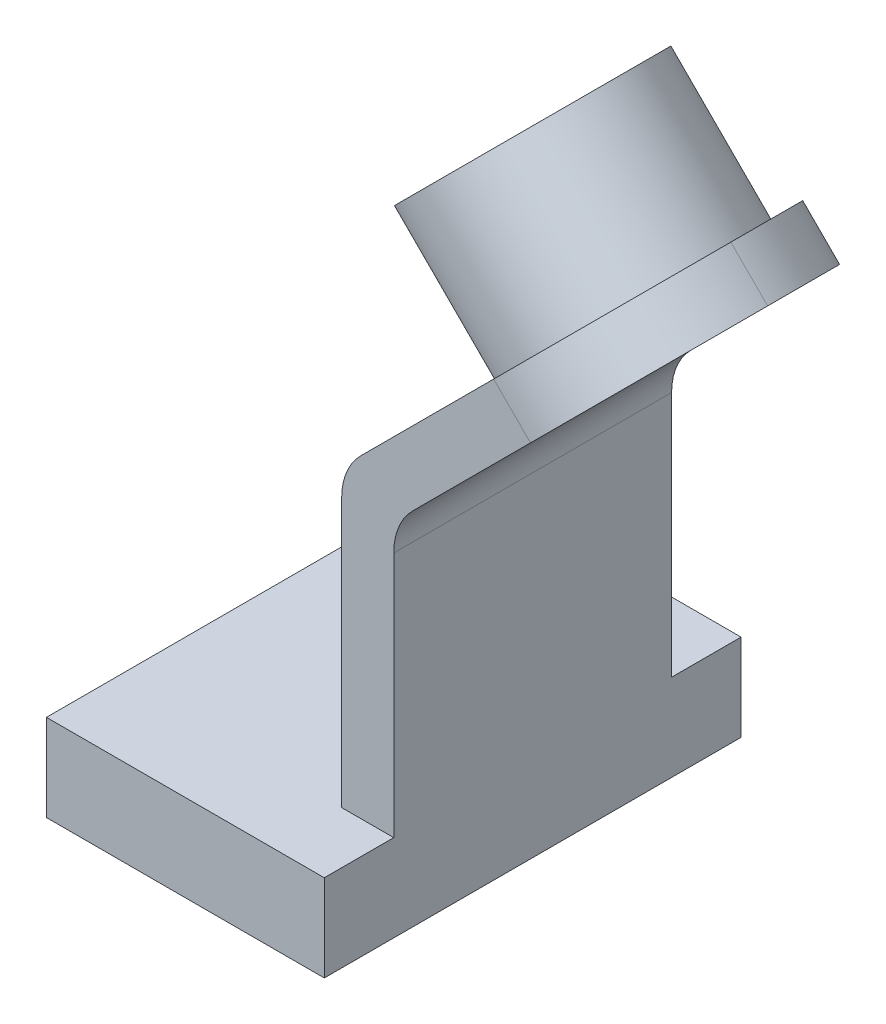
ISO-10303-21;
HEADER;
FILE_DESCRIPTION(('STEP AP214'),'2;1');
FILE_NAME('part.step','',(''),(''),'','','');
FILE_SCHEMA(('AUTOMOTIVE_DESIGN { 1 0 10303 214 1 1 1 1 }'));
ENDSEC;
DATA;
#1=APPLICATION_CONTEXT('core data for automotive mechanical design processes');
#2=APPLICATION_PROTOCOL_DEFINITION('international standard','automotive_design',2000,#1);
#3=PRODUCT_CONTEXT('',#1,'mechanical');
#4=PRODUCT('Part','Part','',(#3));
#5=PRODUCT_RELATED_PRODUCT_CATEGORY('part','',(#4));
#6=PRODUCT_DEFINITION_FORMATION('','',#4);
#7=PRODUCT_DEFINITION_CONTEXT('part definition',#1,'design');
#8=PRODUCT_DEFINITION('design','',#6,#7);
#9=PRODUCT_DEFINITION_SHAPE('','',#8);
#10=(LENGTH_UNIT() NAMED_UNIT(*) SI_UNIT(.MILLI.,.METRE.));
#11=(NAMED_UNIT(*) PLANE_ANGLE_UNIT() SI_UNIT($,.RADIAN.));
#12=(NAMED_UNIT(*) SI_UNIT($,.STERADIAN.) SOLID_ANGLE_UNIT());
#13=UNCERTAINTY_MEASURE_WITH_UNIT(LENGTH_MEASURE(1.E-05),#10,'distance_accuracy_value','');
#14=(GEOMETRIC_REPRESENTATION_CONTEXT(3) GLOBAL_UNCERTAINTY_ASSIGNED_CONTEXT((#13)) GLOBAL_UNIT_ASSIGNED_CONTEXT((#10,
#11,#12)) REPRESENTATION_CONTEXT('',''));
#15=CARTESIAN_POINT('',(0.,0.,0.));
#16=DIRECTION('',(0.,0.,1.));
#17=DIRECTION('',(1.,0.,0.));
#18=AXIS2_PLACEMENT_3D('',#15,#16,#17);
#19=CARTESIAN_POINT('',(0.,10.,48.));
#20=DIRECTION('',(0.,1.,0.));
#21=DIRECTION('',(0.,0.,1.));
#22=AXIS2_PLACEMENT_3D('',#19,#20,#21);
#23=PLANE('',#22);
#24=DIRECTION('',(0.,0.,-1.));
#25=VECTOR('',#24,1.);
#26=CARTESIAN_POINT('',(20.,10.,32.));
#27=LINE('',#26,#25);
#28=CARTESIAN_POINT('',(20.,10.,32.));
#29=VERTEX_POINT('',#28);
#30=CARTESIAN_POINT('',(20.,10.,-32.));
#31=VERTEX_POINT('',#30);
#32=EDGE_CURVE('E130',#29,#31,#27,.T.);
#33=ORIENTED_EDGE('',*,*,#32,.T.);
#34=DIRECTION('',(1.,0.,0.));
#35=VECTOR('',#34,1.);
#36=CARTESIAN_POINT('',(0.,10.,-32.));
#37=LINE('',#36,#35);
#38=CARTESIAN_POINT('',(32.,10.,-32.));
#39=VERTEX_POINT('',#38);
#40=EDGE_CURVE('E166',#31,#39,#37,.T.);
#41=ORIENTED_EDGE('',*,*,#40,.T.);
#42=DIRECTION('',(0.,0.,-1.));
#43=VECTOR('',#42,1.);
#44=CARTESIAN_POINT('',(32.,10.,48.));
#45=LINE('',#44,#43);
#46=CARTESIAN_POINT('',(32.,10.,-48.));
#47=VERTEX_POINT('',#46);
#48=EDGE_CURVE('E196',#39,#47,#45,.T.);
#49=ORIENTED_EDGE('',*,*,#48,.T.);
#50=DIRECTION('',(1.,0.,0.));
#51=VECTOR('',#50,1.);
#52=CARTESIAN_POINT('',(0.,10.,-48.));
#53=LINE('',#52,#51);
#54=CARTESIAN_POINT('',(-32.,10.,-48.));
#55=VERTEX_POINT('',#54);
#56=EDGE_CURVE('E188',#55,#47,#53,.T.);
#57=ORIENTED_EDGE('',*,*,#56,.F.);
#58=DIRECTION('',(0.,0.,-1.));
#59=VECTOR('',#58,1.);
#60=CARTESIAN_POINT('',(-32.,10.,48.));
#61=LINE('',#60,#59);
#62=CARTESIAN_POINT('',(-32.,10.,48.));
#63=VERTEX_POINT('',#62);
#64=EDGE_CURVE('E194',#63,#55,#61,.T.);
#65=ORIENTED_EDGE('',*,*,#64,.F.);
#66=DIRECTION('',(1.,0.,0.));
#67=VECTOR('',#66,1.);
#68=CARTESIAN_POINT('',(0.,10.,48.));
#69=LINE('',#68,#67);
#70=CARTESIAN_POINT('',(32.,10.,48.));
#71=VERTEX_POINT('',#70);
#72=EDGE_CURVE('E177',#63,#71,#69,.T.);
#73=ORIENTED_EDGE('',*,*,#72,.T.);
#74=CARTESIAN_POINT('',(32.,10.,32.));
#75=VERTEX_POINT('',#74);
#76=EDGE_CURVE('E155',#71,#75,#45,.T.);
#77=ORIENTED_EDGE('',*,*,#76,.T.);
#78=DIRECTION('',(1.,0.,0.));
#79=VECTOR('',#78,1.);
#80=CARTESIAN_POINT('',(0.,10.,32.));
#81=LINE('',#80,#79);
#82=EDGE_CURVE('E147',#29,#75,#81,.T.);
#83=ORIENTED_EDGE('',*,*,#82,.F.);
#84=EDGE_LOOP('',(#33,#41,#49,#57,#65,#73,#77,#83));
#85=FACE_BOUND('',#84,.T.);
#86=ADVANCED_FACE('F35',(#85),#23,.T.);
#87=CARTESIAN_POINT('',(0.,-10.,48.));
#88=DIRECTION('',(0.,1.,0.));
#89=DIRECTION('',(0.,0.,1.));
#90=AXIS2_PLACEMENT_3D('',#87,#88,#89);
#91=PLANE('',#90);
#92=DIRECTION('',(1.,0.,0.));
#93=VECTOR('',#92,1.);
#94=CARTESIAN_POINT('',(0.,-10.,-48.));
#95=LINE('',#94,#93);
#96=CARTESIAN_POINT('',(-32.,-10.,-48.));
#97=VERTEX_POINT('',#96);
#98=CARTESIAN_POINT('',(32.,-10.,-48.));
#99=VERTEX_POINT('',#98);
#100=EDGE_CURVE('E142',#97,#99,#95,.T.);
#101=ORIENTED_EDGE('',*,*,#100,.T.);
#102=DIRECTION('',(0.,0.,-1.));
#103=VECTOR('',#102,1.);
#104=CARTESIAN_POINT('',(32.,-10.,48.));
#105=LINE('',#104,#103);
#106=CARTESIAN_POINT('',(32.,-10.,48.));
#107=VERTEX_POINT('',#106);
#108=EDGE_CURVE('E198',#107,#99,#105,.T.);
#109=ORIENTED_EDGE('',*,*,#108,.F.);
#110=DIRECTION('',(1.,0.,0.));
#111=VECTOR('',#110,1.);
#112=CARTESIAN_POINT('',(0.,-10.,48.));
#113=LINE('',#112,#111);
#114=CARTESIAN_POINT('',(-32.,-10.,48.));
#115=VERTEX_POINT('',#114);
#116=EDGE_CURVE('E171',#115,#107,#113,.T.);
#117=ORIENTED_EDGE('',*,*,#116,.F.);
#118=DIRECTION('',(0.,0.,-1.));
#119=VECTOR('',#118,1.);
#120=CARTESIAN_POINT('',(-32.,-10.,48.));
#121=LINE('',#120,#119);
#122=EDGE_CURVE('E182',#115,#97,#121,.T.);
#123=ORIENTED_EDGE('',*,*,#122,.T.);
#124=EDGE_LOOP('',(#101,#109,#117,#123));
#125=FACE_BOUND('',#124,.T.);
#126=ADVANCED_FACE('F290',(#125),#91,.F.);
#127=CARTESIAN_POINT('',(32.,0.,48.));
#128=DIRECTION('',(-1.,0.,0.));
#129=DIRECTION('',(0.,0.,1.));
#130=AXIS2_PLACEMENT_3D('',#127,#128,#129);
#131=PLANE('',#130);
#132=DIRECTION('',(0.,1.,0.));
#133=VECTOR('',#132,1.);
#134=CARTESIAN_POINT('',(32.,0.,-32.));
#135=LINE('',#134,#133);
#136=CARTESIAN_POINT('',(32.,66.7867965644037,-32.));
#137=VERTEX_POINT('',#136);
#138=EDGE_CURVE('E168',#39,#137,#135,.T.);
#139=ORIENTED_EDGE('',*,*,#138,.T.);
#140=DIRECTION('',(0.,0.,-1.));
#141=VECTOR('',#140,1.);
#142=CARTESIAN_POINT('',(32.,66.7867965644037,32.));
#143=LINE('',#142,#141);
#144=CARTESIAN_POINT('',(32.,66.7867965644037,32.));
#145=VERTEX_POINT('',#144);
#146=EDGE_CURVE('E50',#137,#145,#143,.F.);
#147=ORIENTED_EDGE('',*,*,#146,.T.);
#148=DIRECTION('',(0.,1.,0.));
#149=VECTOR('',#148,1.);
#150=CARTESIAN_POINT('',(32.,0.,32.));
#151=LINE('',#150,#149);
#152=EDGE_CURVE('E143',#75,#145,#151,.T.);
#153=ORIENTED_EDGE('',*,*,#152,.F.);
#154=ORIENTED_EDGE('',*,*,#76,.F.);
#155=DIRECTION('',(0.,1.,0.));
#156=VECTOR('',#155,1.);
#157=CARTESIAN_POINT('',(32.,0.,48.));
#158=LINE('',#157,#156);
#159=EDGE_CURVE('E174',#107,#71,#158,.T.);
#160=ORIENTED_EDGE('',*,*,#159,.F.);
#161=ORIENTED_EDGE('',*,*,#108,.T.);
#162=DIRECTION('',(0.,1.,0.));
#163=VECTOR('',#162,1.);
#164=CARTESIAN_POINT('',(32.,0.,-48.));
#165=LINE('',#164,#163);
#166=EDGE_CURVE('E185',#99,#47,#165,.T.);
#167=ORIENTED_EDGE('',*,*,#166,.T.);
#168=ORIENTED_EDGE('',*,*,#48,.F.);
#169=EDGE_LOOP('',(#139,#147,#153,#154,#160,#161,#167,#168));
#170=FACE_BOUND('',#169,.T.);
#171=ADVANCED_FACE('F236',(#170),#131,.F.);
#172=CARTESIAN_POINT('',(-32.,0.,48.));
#173=DIRECTION('',(-1.,0.,0.));
#174=DIRECTION('',(0.,0.,1.));
#175=AXIS2_PLACEMENT_3D('',#172,#173,#174);
#176=PLANE('',#175);
#177=DIRECTION('',(0.,1.,0.));
#178=VECTOR('',#177,1.);
#179=CARTESIAN_POINT('',(-32.,0.,-48.));
#180=LINE('',#179,#178);
#181=EDGE_CURVE('E175',#97,#55,#180,.T.);
#182=ORIENTED_EDGE('',*,*,#181,.F.);
#183=ORIENTED_EDGE('',*,*,#122,.F.);
#184=DIRECTION('',(0.,1.,0.));
#185=VECTOR('',#184,1.);
#186=CARTESIAN_POINT('',(-32.,0.,48.));
#187=LINE('',#186,#185);
#188=EDGE_CURVE('E179',#115,#63,#187,.T.);
#189=ORIENTED_EDGE('',*,*,#188,.T.);
#190=ORIENTED_EDGE('',*,*,#64,.T.);
#191=EDGE_LOOP('',(#182,#183,#189,#190));
#192=FACE_BOUND('',#191,.T.);
#193=ADVANCED_FACE('F283',(#192),#176,.T.);
#194=CARTESIAN_POINT('',(0.,0.,48.));
#195=DIRECTION('',(0.,0.,1.));
#196=DIRECTION('',(1.,0.,0.));
#197=AXIS2_PLACEMENT_3D('',#194,#195,#196);
#198=PLANE('',#197);
#199=ORIENTED_EDGE('',*,*,#116,.T.);
#200=ORIENTED_EDGE('',*,*,#159,.T.);
#201=ORIENTED_EDGE('',*,*,#72,.F.);
#202=ORIENTED_EDGE('',*,*,#188,.F.);
#203=EDGE_LOOP('',(#199,#200,#201,#202));
#204=FACE_BOUND('',#203,.T.);
#205=ADVANCED_FACE('F288',(#204),#198,.T.);
#206=CARTESIAN_POINT('',(0.,0.,-48.));
#207=DIRECTION('',(0.,0.,1.));
#208=DIRECTION('',(1.,0.,0.));
#209=AXIS2_PLACEMENT_3D('',#206,#207,#208);
#210=PLANE('',#209);
#211=ORIENTED_EDGE('',*,*,#100,.F.);
#212=ORIENTED_EDGE('',*,*,#181,.T.);
#213=ORIENTED_EDGE('',*,*,#56,.T.);
#214=ORIENTED_EDGE('',*,*,#166,.F.);
#215=EDGE_LOOP('',(#211,#212,#213,#214));
#216=FACE_BOUND('',#215,.T.);
#217=ADVANCED_FACE('F280',(#216),#210,.F.);
#218=CARTESIAN_POINT('',(-20.4999999999996,20.499999999999,32.));
#219=DIRECTION('',(-0.707106781186557,0.707106781186538,0.));
#220=DIRECTION('',(-0.707106781186538,-0.707106781186557,0.));
#221=AXIS2_PLACEMENT_3D('',#218,#219,#220);
#222=PLANE('',#221);
#223=DIRECTION('',(0.707106781186538,0.707106781186557,0.));
#224=VECTOR('',#223,1.);
#225=CARTESIAN_POINT('',(-20.4999999999996,20.499999999999,32.));
#226=LINE('',#225,#224);
#227=CARTESIAN_POINT('',(36.3933982822017,77.3933982822017,32.));
#228=VERTEX_POINT('',#227);
#229=CARTESIAN_POINT('',(63.5,104.500000000001,32.));
#230=VERTEX_POINT('',#229);
#231=EDGE_CURVE('E169',#228,#230,#226,.T.);
#232=ORIENTED_EDGE('',*,*,#231,.F.);
#233=DIRECTION('',(0.,0.,-1.));
#234=VECTOR('',#233,1.);
#235=CARTESIAN_POINT('',(36.3933982822016,77.3933982822017,-32.));
#236=LINE('',#235,#234);
#237=CARTESIAN_POINT('',(36.3933982822017,77.3933982822017,-32.));
#238=VERTEX_POINT('',#237);
#239=EDGE_CURVE('E227',#228,#238,#236,.T.);
#240=ORIENTED_EDGE('',*,*,#239,.T.);
#241=DIRECTION('',(0.707106781186538,0.707106781186557,0.));
#242=VECTOR('',#241,1.);
#243=CARTESIAN_POINT('',(-20.4999999999996,20.499999999999,-32.));
#244=LINE('',#243,#242);
#245=CARTESIAN_POINT('',(63.5,104.500000000001,-32.));
#246=VERTEX_POINT('',#245);
#247=EDGE_CURVE('E160',#238,#246,#244,.T.);
#248=ORIENTED_EDGE('',*,*,#247,.T.);
#249=CARTESIAN_POINT('',(63.5,104.500000000001,0.));
#250=DIRECTION('',(-0.707106781186557,0.707106781186538,0.));
#251=DIRECTION('',(-0.707106781186538,-0.707106781186557,0.));
#252=AXIS2_PLACEMENT_3D('',#249,#250,#251);
#253=CIRCLE('',#252,32.);
#254=CARTESIAN_POINT('',(86.1274169979692,127.127416997971,0.));
#255=VERTEX_POINT('',#254);
#256=EDGE_CURVE('E212',#246,#255,#253,.F.);
#257=ORIENTED_EDGE('',*,*,#256,.T.);
#258=CARTESIAN_POINT('',(63.5,104.500000000001,0.));
#259=DIRECTION('',(-0.707106781186557,0.707106781186538,0.));
#260=DIRECTION('',(-0.707106781186538,-0.707106781186557,0.));
#261=AXIS2_PLACEMENT_3D('',#258,#259,#260);
#262=CIRCLE('',#261,32.);
#263=EDGE_CURVE('E209',#255,#230,#262,.F.);
#264=ORIENTED_EDGE('',*,*,#263,.T.);
#265=EDGE_LOOP('',(#232,#240,#248,#257,#264));
#266=FACE_BOUND('',#265,.T.);
#267=ADVANCED_FACE('F238',(#266),#222,.F.);
#268=CARTESIAN_POINT('',(-28.9852813742383,28.9852813742375,32.));
#269=DIRECTION('',(-0.707106781186557,0.707106781186538,0.));
#270=DIRECTION('',(-0.707106781186538,-0.707106781186557,0.));
#271=AXIS2_PLACEMENT_3D('',#268,#269,#270);
#272=PLANE('',#271);
#273=CARTESIAN_POINT('',(55.0147186257608,112.985281374239,0.));
#274=DIRECTION('',(-0.707106781186548,0.707106781186547,0.));
#275=DIRECTION('',(-0.707106781186547,-0.707106781186548,0.));
#276=AXIS2_PLACEMENT_3D('',#273,#274,#275);
#277=CIRCLE('',#276,26.0000000000004);
#278=CARTESIAN_POINT('',(36.6299423149103,94.6005050633887,0.));
#279=VERTEX_POINT('',#278);
#280=EDGE_CURVE('E249',#279,#279,#277,.T.);
#281=ORIENTED_EDGE('',*,*,#280,.F.);
#282=EDGE_LOOP('',(#281));
#283=FACE_BOUND('',#282,.T.);
#284=DIRECTION('',(0.707106781186538,0.707106781186557,0.));
#285=VECTOR('',#284,1.);
#286=CARTESIAN_POINT('',(-28.9852813742383,28.9852813742375,-32.));
#287=LINE('',#286,#285);
#288=CARTESIAN_POINT('',(24.3933982822017,82.3639610306788,-32.));
#289=VERTEX_POINT('',#288);
#290=CARTESIAN_POINT('',(55.0147186257613,112.985281374239,-32.));
#291=VERTEX_POINT('',#290);
#292=EDGE_CURVE('E162',#289,#291,#287,.T.);
#293=ORIENTED_EDGE('',*,*,#292,.F.);
#294=DIRECTION('',(0.,0.,-1.));
#295=VECTOR('',#294,1.);
#296=CARTESIAN_POINT('',(24.3933982822017,82.3639610306788,32.));
#297=LINE('',#296,#295);
#298=CARTESIAN_POINT('',(24.3933982822017,82.3639610306788,32.));
#299=VERTEX_POINT('',#298);
#300=EDGE_CURVE('E224',#289,#299,#297,.F.);
#301=ORIENTED_EDGE('',*,*,#300,.T.);
#302=DIRECTION('',(0.707106781186538,0.707106781186557,0.));
#303=VECTOR('',#302,1.);
#304=CARTESIAN_POINT('',(-28.9852813742383,28.9852813742375,32.));
#305=LINE('',#304,#303);
#306=CARTESIAN_POINT('',(55.0147186257614,112.985281374239,32.));
#307=VERTEX_POINT('',#306);
#308=EDGE_CURVE('E150',#299,#307,#305,.T.);
#309=ORIENTED_EDGE('',*,*,#308,.T.);
#310=CARTESIAN_POINT('',(55.0147186257613,112.985281374239,0.));
#311=DIRECTION('',(-0.707106781186557,0.707106781186538,0.));
#312=DIRECTION('',(-0.707106781186538,-0.707106781186557,0.));
#313=AXIS2_PLACEMENT_3D('',#310,#311,#312);
#314=CIRCLE('',#313,32.);
#315=CARTESIAN_POINT('',(77.6421356237306,135.612698372209,0.));
#316=VERTEX_POINT('',#315);
#317=EDGE_CURVE('E201',#307,#316,#314,.T.);
#318=ORIENTED_EDGE('',*,*,#317,.T.);
#319=CARTESIAN_POINT('',(55.0147186257613,112.985281374239,0.));
#320=DIRECTION('',(-0.707106781186557,0.707106781186538,0.));
#321=DIRECTION('',(-0.707106781186538,-0.707106781186557,0.));
#322=AXIS2_PLACEMENT_3D('',#319,#320,#321);
#323=CIRCLE('',#322,32.);
#324=EDGE_CURVE('E203',#316,#291,#323,.T.);
#325=ORIENTED_EDGE('',*,*,#324,.T.);
#326=EDGE_LOOP('',(#293,#301,#309,#318,#325));
#327=FACE_BOUND('',#326,.T.);
#328=ADVANCED_FACE('F266',(#283,#327),#272,.T.);
#329=CARTESIAN_POINT('',(20.,0.,32.));
#330=DIRECTION('',(-1.,0.,0.));
#331=DIRECTION('',(0.,0.,1.));
#332=AXIS2_PLACEMENT_3D('',#329,#330,#331);
#333=PLANE('',#332);
#334=DIRECTION('',(0.,1.,0.));
#335=VECTOR('',#334,1.);
#336=CARTESIAN_POINT('',(20.,0.,32.));
#337=LINE('',#336,#335);
#338=CARTESIAN_POINT('',(20.,71.7573593128807,32.));
#339=VERTEX_POINT('',#338);
#340=EDGE_CURVE('E134',#29,#339,#337,.T.);
#341=ORIENTED_EDGE('',*,*,#340,.T.);
#342=DIRECTION('',(0.,0.,-1.));
#343=VECTOR('',#342,1.);
#344=CARTESIAN_POINT('',(20.,71.7573593128807,32.));
#345=LINE('',#344,#343);
#346=CARTESIAN_POINT('',(20.,71.7573593128807,-32.));
#347=VERTEX_POINT('',#346);
#348=EDGE_CURVE('E217',#339,#347,#345,.T.);
#349=ORIENTED_EDGE('',*,*,#348,.T.);
#350=DIRECTION('',(0.,1.,0.));
#351=VECTOR('',#350,1.);
#352=CARTESIAN_POINT('',(20.,0.,-32.));
#353=LINE('',#352,#351);
#354=EDGE_CURVE('E137',#31,#347,#353,.T.);
#355=ORIENTED_EDGE('',*,*,#354,.F.);
#356=ORIENTED_EDGE('',*,*,#32,.F.);
#357=EDGE_LOOP('',(#341,#349,#355,#356));
#358=FACE_BOUND('',#357,.T.);
#359=ADVANCED_FACE('F132',(#358),#333,.T.);
#360=CARTESIAN_POINT('',(0.,0.,32.));
#361=DIRECTION('',(0.,0.,1.));
#362=DIRECTION('',(1.,0.,0.));
#363=AXIS2_PLACEMENT_3D('',#360,#361,#362);
#364=PLANE('',#363);
#365=ORIENTED_EDGE('',*,*,#308,.F.);
#366=CARTESIAN_POINT('',(35.,71.7573593128807,32.));
#367=DIRECTION('',(0.,0.,1.));
#368=DIRECTION('',(1.,0.,0.));
#369=AXIS2_PLACEMENT_3D('',#366,#367,#368);
#370=CIRCLE('',#369,15.);
#371=EDGE_CURVE('E149',#299,#339,#370,.T.);
#372=ORIENTED_EDGE('',*,*,#371,.T.);
#373=ORIENTED_EDGE('',*,*,#340,.F.);
#374=ORIENTED_EDGE('',*,*,#82,.T.);
#375=ORIENTED_EDGE('',*,*,#152,.T.);
#376=CARTESIAN_POINT('',(47.,66.7867965644037,32.));
#377=DIRECTION('',(0.,0.,1.));
#378=DIRECTION('',(1.,0.,0.));
#379=AXIS2_PLACEMENT_3D('',#376,#377,#378);
#380=CIRCLE('',#379,15.);
#381=EDGE_CURVE('E11',#145,#228,#380,.F.);
#382=ORIENTED_EDGE('',*,*,#381,.T.);
#383=ORIENTED_EDGE('',*,*,#231,.T.);
#384=DIRECTION('',(-0.707106781186556,0.707106781186539,0.));
#385=VECTOR('',#384,1.);
#386=CARTESIAN_POINT('',(55.0147186257613,112.985281374239,32.));
#387=LINE('',#386,#385);
#388=EDGE_CURVE('E214',#230,#307,#387,.T.);
#389=ORIENTED_EDGE('',*,*,#388,.T.);
#390=EDGE_LOOP('',(#365,#372,#373,#374,#375,#382,#383,#389));
#391=FACE_BOUND('',#390,.T.);
#392=ADVANCED_FACE('F146',(#391),#364,.T.);
#393=CARTESIAN_POINT('',(0.,0.,-32.));
#394=DIRECTION('',(0.,0.,1.));
#395=DIRECTION('',(1.,0.,0.));
#396=AXIS2_PLACEMENT_3D('',#393,#394,#395);
#397=PLANE('',#396);
#398=ORIENTED_EDGE('',*,*,#354,.T.);
#399=CARTESIAN_POINT('',(35.,71.7573593128807,-32.));
#400=DIRECTION('',(0.,0.,1.));
#401=DIRECTION('',(1.,0.,0.));
#402=AXIS2_PLACEMENT_3D('',#399,#400,#401);
#403=CIRCLE('',#402,15.);
#404=EDGE_CURVE('E222',#347,#289,#403,.F.);
#405=ORIENTED_EDGE('',*,*,#404,.T.);
#406=ORIENTED_EDGE('',*,*,#292,.T.);
#407=DIRECTION('',(-0.707106781186556,0.707106781186539,0.));
#408=VECTOR('',#407,1.);
#409=CARTESIAN_POINT('',(83.9999999999997,84.0000000000017,-32.));
#410=LINE('',#409,#408);
#411=EDGE_CURVE('E206',#291,#246,#410,.F.);
#412=ORIENTED_EDGE('',*,*,#411,.T.);
#413=ORIENTED_EDGE('',*,*,#247,.F.);
#414=CARTESIAN_POINT('',(47.,66.7867965644037,-32.));
#415=DIRECTION('',(0.,0.,1.));
#416=DIRECTION('',(1.,0.,0.));
#417=AXIS2_PLACEMENT_3D('',#414,#415,#416);
#418=CIRCLE('',#417,15.);
#419=EDGE_CURVE('E43',#238,#137,#418,.T.);
#420=ORIENTED_EDGE('',*,*,#419,.T.);
#421=ORIENTED_EDGE('',*,*,#138,.F.);
#422=ORIENTED_EDGE('',*,*,#40,.F.);
#423=EDGE_LOOP('',(#398,#405,#406,#412,#413,#420,#421,#422));
#424=FACE_BOUND('',#423,.T.);
#425=ADVANCED_FACE('F232',(#424),#397,.F.);
#426=CARTESIAN_POINT('',(83.9999999999997,84.0000000000017,0.));
#427=DIRECTION('',(0.707106781186556,-0.707106781186539,0.));
#428=DIRECTION('',(0.707106781186539,0.707106781186556,0.));
#429=AXIS2_PLACEMENT_3D('',#426,#427,#428);
#430=CYLINDRICAL_SURFACE('',#429,32.);
#431=ORIENTED_EDGE('',*,*,#388,.F.);
#432=ORIENTED_EDGE('',*,*,#263,.F.);
#433=DIRECTION('',(-0.707106781186556,0.707106781186539,0.));
#434=VECTOR('',#433,1.);
#435=CARTESIAN_POINT('',(86.1274169979692,127.127416997971,0.));
#436=LINE('',#435,#434);
#437=EDGE_CURVE('E163',#316,#255,#436,.F.);
#438=ORIENTED_EDGE('',*,*,#437,.F.);
#439=ORIENTED_EDGE('',*,*,#317,.F.);
#440=EDGE_LOOP('',(#431,#432,#438,#439));
#441=FACE_BOUND('',#440,.T.);
#442=ADVANCED_FACE('F303',(#441),#430,.T.);
#443=CARTESIAN_POINT('',(83.9999999999997,84.0000000000017,0.));
#444=DIRECTION('',(-0.707106781186556,0.707106781186539,0.));
#445=DIRECTION('',(-0.707106781186539,-0.707106781186556,0.));
#446=AXIS2_PLACEMENT_3D('',#443,#444,#445);
#447=CYLINDRICAL_SURFACE('',#446,32.);
#448=ORIENTED_EDGE('',*,*,#256,.F.);
#449=ORIENTED_EDGE('',*,*,#411,.F.);
#450=ORIENTED_EDGE('',*,*,#324,.F.);
#451=ORIENTED_EDGE('',*,*,#437,.T.);
#452=EDGE_LOOP('',(#448,#449,#450,#451));
#453=FACE_BOUND('',#452,.T.);
#454=ADVANCED_FACE('F300',(#453),#447,.T.);
#455=CARTESIAN_POINT('',(35.,71.7573593128807,32.));
#456=DIRECTION('',(0.,0.,-1.));
#457=DIRECTION('',(-1.,0.,0.));
#458=AXIS2_PLACEMENT_3D('',#455,#456,#457);
#459=CYLINDRICAL_SURFACE('',#458,15.);
#460=ORIENTED_EDGE('',*,*,#371,.F.);
#461=ORIENTED_EDGE('',*,*,#300,.F.);
#462=ORIENTED_EDGE('',*,*,#404,.F.);
#463=ORIENTED_EDGE('',*,*,#348,.F.);
#464=EDGE_LOOP('',(#460,#461,#462,#463));
#465=FACE_BOUND('',#464,.T.);
#466=ADVANCED_FACE('F275',(#465),#459,.T.);
#467=CARTESIAN_POINT('',(47.,66.7867965644037,32.));
#468=DIRECTION('',(0.,0.,1.));
#469=DIRECTION('',(1.,0.,0.));
#470=AXIS2_PLACEMENT_3D('',#467,#468,#469);
#471=CYLINDRICAL_SURFACE('',#470,15.);
#472=ORIENTED_EDGE('',*,*,#381,.F.);
#473=ORIENTED_EDGE('',*,*,#146,.F.);
#474=ORIENTED_EDGE('',*,*,#419,.F.);
#475=ORIENTED_EDGE('',*,*,#239,.F.);
#476=EDGE_LOOP('',(#472,#473,#474,#475));
#477=FACE_BOUND('',#476,.T.);
#478=ADVANCED_FACE('F37',(#477),#471,.F.);
#479=CARTESIAN_POINT('',(-52.0000000000008,51.9999999999994,0.));
#480=DIRECTION('',(0.707106781186548,-0.707106781186547,0.));
#481=DIRECTION('',(0.707106781186547,0.707106781186548,0.));
#482=AXIS2_PLACEMENT_3D('',#479,#480,#481);
#483=PLANE('',#482);
#484=CARTESIAN_POINT('',(31.9999999999998,136.,0.));
#485=DIRECTION('',(-0.707106781186548,0.707106781186547,0.));
#486=DIRECTION('',(-0.707106781186547,-0.707106781186548,0.));
#487=AXIS2_PLACEMENT_3D('',#484,#485,#486);
#488=CIRCLE('',#487,16.0000000000001);
#489=CARTESIAN_POINT('',(20.686291501015,124.686291501015,0.));
#490=VERTEX_POINT('',#489);
#491=EDGE_CURVE('E220',#490,#490,#488,.T.);
#492=ORIENTED_EDGE('',*,*,#491,.F.);
#493=EDGE_LOOP('',(#492));
#494=FACE_BOUND('',#493,.T.);
#495=CARTESIAN_POINT('',(31.9999999999998,136.,0.));
#496=DIRECTION('',(-0.707106781186548,0.707106781186547,0.));
#497=DIRECTION('',(-0.707106781186547,-0.707106781186548,0.));
#498=AXIS2_PLACEMENT_3D('',#495,#496,#497);
#499=CIRCLE('',#498,26.);
#500=CARTESIAN_POINT('',(13.6152236891495,117.61522368915,0.));
#501=VERTEX_POINT('',#500);
#502=EDGE_CURVE('E252',#501,#501,#499,.T.);
#503=ORIENTED_EDGE('',*,*,#502,.T.);
#504=EDGE_LOOP('',(#503));
#505=FACE_BOUND('',#504,.T.);
#506=ADVANCED_FACE('F256',(#494,#505),#483,.F.);
#507=CARTESIAN_POINT('',(32.,136.,0.));
#508=DIRECTION('',(-0.707106781186548,0.707106781186547,0.));
#509=DIRECTION('',(-0.707106781186547,-0.707106781186548,0.));
#510=AXIS2_PLACEMENT_3D('',#507,#508,#509);
#511=CYLINDRICAL_SURFACE('',#510,16.0000000000003);
#512=CARTESIAN_POINT('',(55.0147186257609,112.985281374239,0.));
#513=DIRECTION('',(-0.707106781186548,0.707106781186547,0.));
#514=DIRECTION('',(-0.707106781186547,-0.707106781186548,0.));
#515=AXIS2_PLACEMENT_3D('',#512,#513,#514);
#516=CIRCLE('',#515,16.0000000000004);
#517=CARTESIAN_POINT('',(43.7010101267758,101.671572875254,0.));
#518=VERTEX_POINT('',#517);
#519=EDGE_CURVE('E246',#518,#518,#516,.T.);
#520=ORIENTED_EDGE('',*,*,#519,.F.);
#521=EDGE_LOOP('',(#520));
#522=FACE_BOUND('',#521,.T.);
#523=ORIENTED_EDGE('',*,*,#491,.T.);
#524=EDGE_LOOP('',(#523));
#525=FACE_BOUND('',#524,.T.);
#526=ADVANCED_FACE('F262',(#522,#525),#511,.F.);
#527=CARTESIAN_POINT('',(32.,136.,0.));
#528=DIRECTION('',(-0.707106781186548,0.707106781186547,0.));
#529=DIRECTION('',(-0.707106781186547,-0.707106781186548,0.));
#530=AXIS2_PLACEMENT_3D('',#527,#528,#529);
#531=CYLINDRICAL_SURFACE('',#530,26.0000000000002);
#532=ORIENTED_EDGE('',*,*,#502,.F.);
#533=EDGE_LOOP('',(#532));
#534=FACE_BOUND('',#533,.T.);
#535=ORIENTED_EDGE('',*,*,#280,.T.);
#536=EDGE_LOOP('',(#535));
#537=FACE_BOUND('',#536,.T.);
#538=ADVANCED_FACE('F258',(#534,#537),#531,.T.);
#539=ORIENTED_EDGE('',*,*,#519,.T.);
#540=EDGE_LOOP('',(#539));
#541=FACE_BOUND('',#540,.T.);
#542=ADVANCED_FACE('F261',(#541),#272,.T.);
#543=CLOSED_SHELL('',(#86,#126,#171,#193,#205,#217,#267,#328,#359,#392,#425,#442,#454,#466,#478,
#506,#526,#538,#542));
#544=MANIFOLD_SOLID_BREP('B2',#543);
#545=ADVANCED_BREP_SHAPE_REPRESENTATION('',(#18,#544),#14);
#546=SHAPE_DEFINITION_REPRESENTATION(#9,#545);
ENDSEC;
END-ISO-10303-21;
